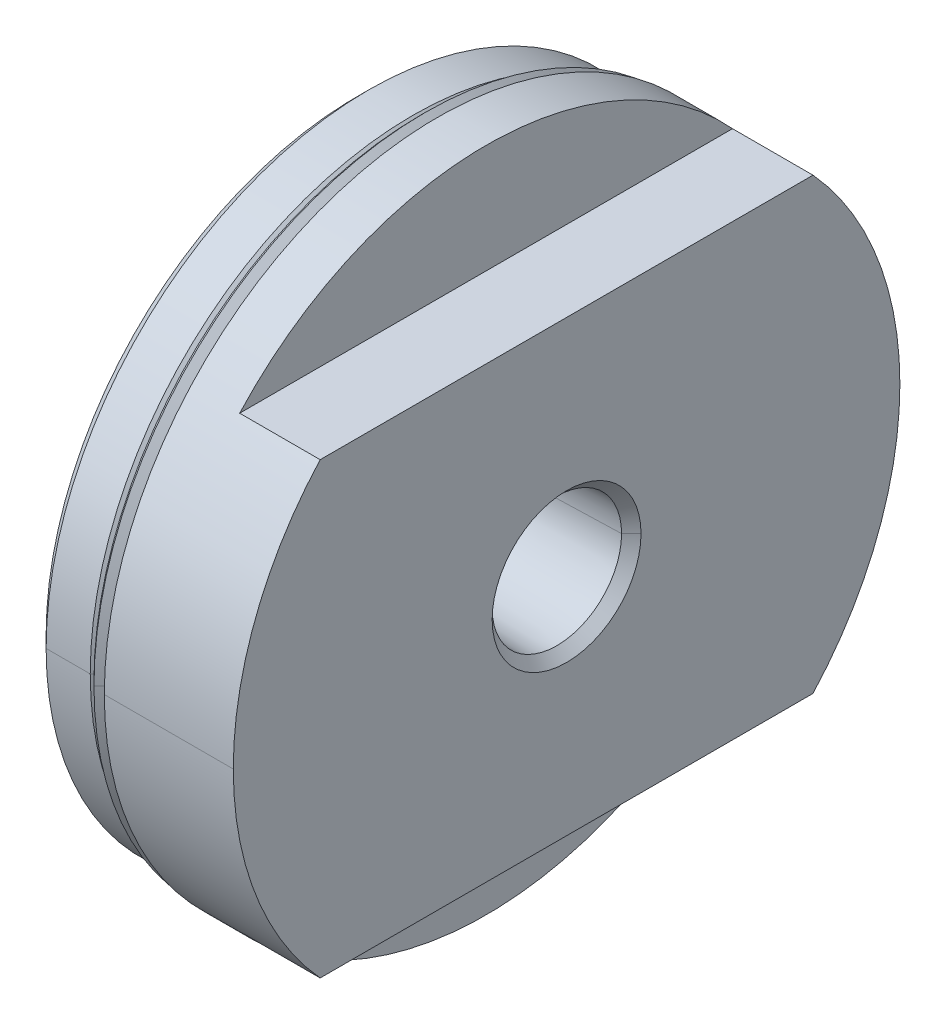
ISO-10303-21;
HEADER;
FILE_DESCRIPTION(('STEP AP214'),'2;1');
FILE_NAME('part.step','',(''),(''),'','','');
FILE_SCHEMA(('AUTOMOTIVE_DESIGN { 1 0 10303 214 1 1 1 1 }'));
ENDSEC;
DATA;
#1=APPLICATION_CONTEXT('core data for automotive mechanical design processes');
#2=APPLICATION_PROTOCOL_DEFINITION('international standard','automotive_design',2000,#1);
#3=PRODUCT_CONTEXT('',#1,'mechanical');
#4=PRODUCT('Part','Part','',(#3));
#5=PRODUCT_RELATED_PRODUCT_CATEGORY('part','',(#4));
#6=PRODUCT_DEFINITION_FORMATION('','',#4);
#7=PRODUCT_DEFINITION_CONTEXT('part definition',#1,'design');
#8=PRODUCT_DEFINITION('design','',#6,#7);
#9=PRODUCT_DEFINITION_SHAPE('','',#8);
#10=(LENGTH_UNIT() NAMED_UNIT(*) SI_UNIT(.MILLI.,.METRE.));
#11=(NAMED_UNIT(*) PLANE_ANGLE_UNIT() SI_UNIT($,.RADIAN.));
#12=(NAMED_UNIT(*) SI_UNIT($,.STERADIAN.) SOLID_ANGLE_UNIT());
#13=UNCERTAINTY_MEASURE_WITH_UNIT(LENGTH_MEASURE(1.E-05),#10,'distance_accuracy_value','');
#14=(GEOMETRIC_REPRESENTATION_CONTEXT(3) GLOBAL_UNCERTAINTY_ASSIGNED_CONTEXT((#13)) GLOBAL_UNIT_ASSIGNED_CONTEXT((#10,
#11,#12)) REPRESENTATION_CONTEXT('',''));
#15=CARTESIAN_POINT('',(0.,0.,0.));
#16=DIRECTION('',(0.,0.,1.));
#17=DIRECTION('',(1.,0.,0.));
#18=AXIS2_PLACEMENT_3D('',#15,#16,#17);
#19=CARTESIAN_POINT('',(12.7,0.,0.));
#20=DIRECTION('',(1.,0.,0.));
#21=DIRECTION('',(0.,0.,-1.));
#22=AXIS2_PLACEMENT_3D('',#19,#20,#21);
#23=PLANE('',#22);
#24=DIRECTION('',(0.,0.,1.));
#25=VECTOR('',#24,1.);
#26=CARTESIAN_POINT('',(12.7,22.098,-32.8168));
#27=LINE('',#26,#25);
#28=CARTESIAN_POINT('',(12.7,22.098,-24.2615077486953));
#29=VERTEX_POINT('',#28);
#30=CARTESIAN_POINT('',(12.7,22.098,24.2615077486953));
#31=VERTEX_POINT('',#30);
#32=EDGE_CURVE('E10',#29,#31,#27,.T.);
#33=ORIENTED_EDGE('',*,*,#32,.F.);
#34=CARTESIAN_POINT('',(12.7,0.,0.));
#35=DIRECTION('',(1.,0.,0.));
#36=DIRECTION('',(0.,0.,-1.));
#37=AXIS2_PLACEMENT_3D('',#34,#35,#36);
#38=CIRCLE('',#37,32.8168);
#39=EDGE_CURVE('E24',#29,#31,#38,.T.);
#40=ORIENTED_EDGE('',*,*,#39,.T.);
#41=EDGE_LOOP('',(#33,#40));
#42=FACE_BOUND('',#41,.T.);
#43=ADVANCED_FACE('F16',(#42),#23,.T.);
#44=CARTESIAN_POINT('',(20.6248,0.,0.));
#45=DIRECTION('',(-1.,0.,0.));
#46=DIRECTION('',(0.,-1.,0.));
#47=AXIS2_PLACEMENT_3D('',#44,#45,#46);
#48=CYLINDRICAL_SURFACE('',#47,32.8168);
#49=CARTESIAN_POINT('',(20.6248,0.,0.));
#50=DIRECTION('',(1.,0.,0.));
#51=DIRECTION('',(0.,0.,-1.));
#52=AXIS2_PLACEMENT_3D('',#49,#50,#51);
#53=CIRCLE('',#52,32.8168);
#54=CARTESIAN_POINT('',(20.6248,22.098,24.2615077486953));
#55=VERTEX_POINT('',#54);
#56=CARTESIAN_POINT('',(20.6248,0.,32.8168));
#57=VERTEX_POINT('',#56);
#58=EDGE_CURVE('E492',#55,#57,#53,.T.);
#59=ORIENTED_EDGE('',*,*,#58,.F.);
#60=DIRECTION('',(1.,0.,0.));
#61=VECTOR('',#60,1.);
#62=CARTESIAN_POINT('',(20.6248,22.098,24.2615077486953));
#63=LINE('',#62,#61);
#64=EDGE_CURVE('E487',#31,#55,#63,.T.);
#65=ORIENTED_EDGE('',*,*,#64,.F.);
#66=ORIENTED_EDGE('',*,*,#39,.F.);
#67=DIRECTION('',(1.,0.,0.));
#68=VECTOR('',#67,1.);
#69=CARTESIAN_POINT('',(20.6248,22.098,-24.2615077486953));
#70=LINE('',#69,#68);
#71=CARTESIAN_POINT('',(20.6248,22.098,-24.2615077486953));
#72=VERTEX_POINT('',#71);
#73=EDGE_CURVE('E483',#29,#72,#70,.T.);
#74=ORIENTED_EDGE('',*,*,#73,.T.);
#75=CARTESIAN_POINT('',(20.6248,0.,0.));
#76=DIRECTION('',(1.,0.,0.));
#77=DIRECTION('',(0.,0.,-1.));
#78=AXIS2_PLACEMENT_3D('',#75,#76,#77);
#79=CIRCLE('',#78,32.8168);
#80=CARTESIAN_POINT('',(20.6248,0.,-32.8168));
#81=VERTEX_POINT('',#80);
#82=EDGE_CURVE('E478',#81,#72,#79,.T.);
#83=ORIENTED_EDGE('',*,*,#82,.F.);
#84=DIRECTION('',(-1.,0.,0.));
#85=VECTOR('',#84,1.);
#86=CARTESIAN_POINT('',(20.6248,0.,-32.8168));
#87=LINE('',#86,#85);
#88=CARTESIAN_POINT('',(7.9248,0.,-32.8168));
#89=VERTEX_POINT('',#88);
#90=EDGE_CURVE('E474',#81,#89,#87,.T.);
#91=ORIENTED_EDGE('',*,*,#90,.T.);
#92=CARTESIAN_POINT('',(7.9248,0.,0.));
#93=DIRECTION('',(1.,0.,0.));
#94=DIRECTION('',(0.,0.,-1.));
#95=AXIS2_PLACEMENT_3D('',#92,#93,#94);
#96=CIRCLE('',#95,32.8168);
#97=CARTESIAN_POINT('',(7.9248,0.,32.8168));
#98=VERTEX_POINT('',#97);
#99=EDGE_CURVE('E470',#89,#98,#96,.T.);
#100=ORIENTED_EDGE('',*,*,#99,.T.);
#101=DIRECTION('',(-1.,0.,0.));
#102=VECTOR('',#101,1.);
#103=CARTESIAN_POINT('',(20.6248,0.,32.8168));
#104=LINE('',#103,#102);
#105=EDGE_CURVE('E465',#57,#98,#104,.T.);
#106=ORIENTED_EDGE('',*,*,#105,.F.);
#107=EDGE_LOOP('',(#59,#65,#66,#74,#83,#91,#100,#106));
#108=FACE_BOUND('',#107,.T.);
#109=ADVANCED_FACE('F507',(#108),#48,.T.);
#110=CARTESIAN_POINT('',(20.6248,0.,0.));
#111=DIRECTION('',(-1.,0.,0.));
#112=DIRECTION('',(0.,1.,0.));
#113=AXIS2_PLACEMENT_3D('',#110,#111,#112);
#114=CYLINDRICAL_SURFACE('',#113,32.8168);
#115=CARTESIAN_POINT('',(7.9248,0.,0.));
#116=DIRECTION('',(1.,0.,0.));
#117=DIRECTION('',(0.,0.,-1.));
#118=AXIS2_PLACEMENT_3D('',#115,#116,#117);
#119=CIRCLE('',#118,32.8168);
#120=EDGE_CURVE('E460',#98,#89,#119,.T.);
#121=ORIENTED_EDGE('',*,*,#120,.T.);
#122=ORIENTED_EDGE('',*,*,#90,.F.);
#123=CARTESIAN_POINT('',(20.6248,0.,0.));
#124=DIRECTION('',(1.,0.,0.));
#125=DIRECTION('',(0.,0.,-1.));
#126=AXIS2_PLACEMENT_3D('',#123,#124,#125);
#127=CIRCLE('',#126,32.8168);
#128=CARTESIAN_POINT('',(20.6248,-22.098,-24.2615077486953));
#129=VERTEX_POINT('',#128);
#130=EDGE_CURVE('E455',#129,#81,#127,.T.);
#131=ORIENTED_EDGE('',*,*,#130,.F.);
#132=DIRECTION('',(1.,0.,0.));
#133=VECTOR('',#132,1.);
#134=CARTESIAN_POINT('',(20.6248,-22.098,-24.2615077486953));
#135=LINE('',#134,#133);
#136=CARTESIAN_POINT('',(12.7,-22.098,-24.2615077486953));
#137=VERTEX_POINT('',#136);
#138=EDGE_CURVE('E450',#137,#129,#135,.T.);
#139=ORIENTED_EDGE('',*,*,#138,.F.);
#140=CARTESIAN_POINT('',(12.7,0.,0.));
#141=DIRECTION('',(1.,0.,0.));
#142=DIRECTION('',(0.,0.,-1.));
#143=AXIS2_PLACEMENT_3D('',#140,#141,#142);
#144=CIRCLE('',#143,32.8168);
#145=CARTESIAN_POINT('',(12.7,-22.098,24.2615077486953));
#146=VERTEX_POINT('',#145);
#147=EDGE_CURVE('E445',#146,#137,#144,.T.);
#148=ORIENTED_EDGE('',*,*,#147,.F.);
#149=DIRECTION('',(1.,0.,0.));
#150=VECTOR('',#149,1.);
#151=CARTESIAN_POINT('',(20.6248,-22.098,24.2615077486953));
#152=LINE('',#151,#150);
#153=CARTESIAN_POINT('',(20.6248,-22.098,24.2615077486953));
#154=VERTEX_POINT('',#153);
#155=EDGE_CURVE('E441',#146,#154,#152,.T.);
#156=ORIENTED_EDGE('',*,*,#155,.T.);
#157=CARTESIAN_POINT('',(20.6248,0.,0.));
#158=DIRECTION('',(1.,0.,0.));
#159=DIRECTION('',(0.,0.,-1.));
#160=AXIS2_PLACEMENT_3D('',#157,#158,#159);
#161=CIRCLE('',#160,32.8168);
#162=EDGE_CURVE('E436',#57,#154,#161,.T.);
#163=ORIENTED_EDGE('',*,*,#162,.F.);
#164=ORIENTED_EDGE('',*,*,#105,.T.);
#165=EDGE_LOOP('',(#121,#122,#131,#139,#148,#156,#163,#164));
#166=FACE_BOUND('',#165,.T.);
#167=ADVANCED_FACE('F511',(#166),#114,.T.);
#168=CARTESIAN_POINT('',(20.6248,32.8168,0.));
#169=DIRECTION('',(-1.,0.,0.));
#170=DIRECTION('',(0.,0.,1.));
#171=AXIS2_PLACEMENT_3D('',#168,#169,#170);
#172=PLANE('',#171);
#173=CARTESIAN_POINT('',(20.6248,0.,0.));
#174=DIRECTION('',(1.,0.,0.));
#175=DIRECTION('',(0.,0.,-1.));
#176=AXIS2_PLACEMENT_3D('',#173,#174,#175);
#177=CIRCLE('',#176,7.32950374584);
#178=CARTESIAN_POINT('',(20.6248,0.,-7.32950374590799));
#179=VERTEX_POINT('',#178);
#180=CARTESIAN_POINT('',(20.6248000003261,0.,7.32950374551395));
#181=VERTEX_POINT('',#180);
#182=EDGE_CURVE('E431',#179,#181,#177,.T.);
#183=ORIENTED_EDGE('',*,*,#182,.F.);
#184=CARTESIAN_POINT('',(20.6248,0.,0.));
#185=DIRECTION('',(1.,0.,0.));
#186=DIRECTION('',(0.,0.,-1.));
#187=AXIS2_PLACEMENT_3D('',#184,#185,#186);
#188=CIRCLE('',#187,7.32950374584);
#189=EDGE_CURVE('E426',#181,#179,#188,.T.);
#190=ORIENTED_EDGE('',*,*,#189,.F.);
#191=EDGE_LOOP('',(#183,#190));
#192=FACE_BOUND('',#191,.T.);
#193=DIRECTION('',(0.,0.,-1.));
#194=VECTOR('',#193,1.);
#195=CARTESIAN_POINT('',(20.6248,22.098,0.));
#196=LINE('',#195,#194);
#197=EDGE_CURVE('E421',#55,#72,#196,.T.);
#198=ORIENTED_EDGE('',*,*,#197,.F.);
#199=ORIENTED_EDGE('',*,*,#58,.T.);
#200=ORIENTED_EDGE('',*,*,#162,.T.);
#201=DIRECTION('',(0.,0.,1.));
#202=VECTOR('',#201,1.);
#203=CARTESIAN_POINT('',(20.6248,-22.098,0.));
#204=LINE('',#203,#202);
#205=EDGE_CURVE('E416',#129,#154,#204,.T.);
#206=ORIENTED_EDGE('',*,*,#205,.F.);
#207=ORIENTED_EDGE('',*,*,#130,.T.);
#208=ORIENTED_EDGE('',*,*,#82,.T.);
#209=EDGE_LOOP('',(#198,#199,#200,#206,#207,#208));
#210=FACE_BOUND('',#209,.T.);
#211=ADVANCED_FACE('F503',(#192,#210),#172,.F.);
#212=CARTESIAN_POINT('',(12.7,-22.098,32.8168));
#213=DIRECTION('',(0.,-1.,0.));
#214=DIRECTION('',(0.,0.,-1.));
#215=AXIS2_PLACEMENT_3D('',#212,#213,#214);
#216=PLANE('',#215);
#217=ORIENTED_EDGE('',*,*,#138,.T.);
#218=ORIENTED_EDGE('',*,*,#205,.T.);
#219=ORIENTED_EDGE('',*,*,#155,.F.);
#220=DIRECTION('',(0.,0.,-1.));
#221=VECTOR('',#220,1.);
#222=CARTESIAN_POINT('',(12.7,-22.098,32.8168));
#223=LINE('',#222,#221);
#224=EDGE_CURVE('E411',#146,#137,#223,.T.);
#225=ORIENTED_EDGE('',*,*,#224,.T.);
#226=EDGE_LOOP('',(#217,#218,#219,#225));
#227=FACE_BOUND('',#226,.T.);
#228=ADVANCED_FACE('F515',(#227),#216,.T.);
#229=CARTESIAN_POINT('',(12.7,0.,0.));
#230=DIRECTION('',(1.,0.,0.));
#231=DIRECTION('',(0.,0.,-1.));
#232=AXIS2_PLACEMENT_3D('',#229,#230,#231);
#233=PLANE('',#232);
#234=ORIENTED_EDGE('',*,*,#147,.T.);
#235=ORIENTED_EDGE('',*,*,#224,.F.);
#236=EDGE_LOOP('',(#234,#235));
#237=FACE_BOUND('',#236,.T.);
#238=ADVANCED_FACE('F517',(#237),#233,.T.);
#239=CARTESIAN_POINT('',(12.7,22.098,-32.8168));
#240=DIRECTION('',(0.,1.,0.));
#241=DIRECTION('',(0.,0.,1.));
#242=AXIS2_PLACEMENT_3D('',#239,#240,#241);
#243=PLANE('',#242);
#244=ORIENTED_EDGE('',*,*,#64,.T.);
#245=ORIENTED_EDGE('',*,*,#197,.T.);
#246=ORIENTED_EDGE('',*,*,#73,.F.);
#247=ORIENTED_EDGE('',*,*,#32,.T.);
#248=EDGE_LOOP('',(#244,#245,#246,#247));
#249=FACE_BOUND('',#248,.T.);
#250=ADVANCED_FACE('F519',(#249),#243,.T.);
#251=CARTESIAN_POINT('',(19.667430358377,0.,0.));
#252=DIRECTION('',(1.,0.,0.));
#253=DIRECTION('',(0.,1.,0.));
#254=AXIS2_PLACEMENT_3D('',#251,#252,#253);
#255=CONICAL_SURFACE('',#254,6.37213410356,0.7853981634);
#256=CARTESIAN_POINT('',(19.667430358377,0.,0.));
#257=DIRECTION('',(1.,0.,0.));
#258=DIRECTION('',(0.,0.,-1.));
#259=AXIS2_PLACEMENT_3D('',#256,#257,#258);
#260=CIRCLE('',#259,6.37213410356);
#261=CARTESIAN_POINT('',(19.667430358377,0.,6.37213410356));
#262=VERTEX_POINT('',#261);
#263=CARTESIAN_POINT('',(19.667430358377,0.,-6.3721341042854));
#264=VERTEX_POINT('',#263);
#265=EDGE_CURVE('E406',#262,#264,#260,.T.);
#266=ORIENTED_EDGE('',*,*,#265,.F.);
#267=DIRECTION('',(0.707106781184742,0.,0.707106781188353));
#268=VECTOR('',#267,1.);
#269=CARTESIAN_POINT('',(19.667430358377,0.,6.37213410356));
#270=LINE('',#269,#268);
#271=EDGE_CURVE('E401',#262,#181,#270,.T.);
#272=ORIENTED_EDGE('',*,*,#271,.T.);
#273=ORIENTED_EDGE('',*,*,#189,.T.);
#274=DIRECTION('',(0.707106781184742,0.,-0.707106781188353));
#275=VECTOR('',#274,1.);
#276=CARTESIAN_POINT('',(19.667430358377,0.,-6.37213410356));
#277=LINE('',#276,#275);
#278=EDGE_CURVE('E396',#264,#179,#277,.T.);
#279=ORIENTED_EDGE('',*,*,#278,.F.);
#280=EDGE_LOOP('',(#266,#272,#273,#279));
#281=FACE_BOUND('',#280,.T.);
#282=ADVANCED_FACE('F526',(#281),#255,.F.);
#283=CARTESIAN_POINT('',(19.667430358377,0.,0.));
#284=DIRECTION('',(1.,0.,0.));
#285=DIRECTION('',(0.,-1.,0.));
#286=AXIS2_PLACEMENT_3D('',#283,#284,#285);
#287=CONICAL_SURFACE('',#286,6.37213410356,0.7853981634);
#288=ORIENTED_EDGE('',*,*,#182,.T.);
#289=ORIENTED_EDGE('',*,*,#271,.F.);
#290=CARTESIAN_POINT('',(19.667430358377,0.,0.));
#291=DIRECTION('',(1.,0.,0.));
#292=DIRECTION('',(0.,0.,-1.));
#293=AXIS2_PLACEMENT_3D('',#290,#291,#292);
#294=CIRCLE('',#293,6.37213410356);
#295=EDGE_CURVE('E391',#264,#262,#294,.T.);
#296=ORIENTED_EDGE('',*,*,#295,.F.);
#297=ORIENTED_EDGE('',*,*,#278,.T.);
#298=EDGE_LOOP('',(#288,#289,#296,#297));
#299=FACE_BOUND('',#298,.T.);
#300=ADVANCED_FACE('F547',(#299),#287,.F.);
#301=CARTESIAN_POINT('',(10.5918,0.,0.));
#302=DIRECTION('',(1.,0.,0.));
#303=DIRECTION('',(0.,-1.,0.));
#304=AXIS2_PLACEMENT_3D('',#301,#302,#303);
#305=CONICAL_SURFACE('',#304,6.08879708324,0.031209405);
#306=ORIENTED_EDGE('',*,*,#295,.T.);
#307=DIRECTION('',(0.999513026048845,0.,0.0312043387797565));
#308=VECTOR('',#307,1.);
#309=CARTESIAN_POINT('',(10.5918,0.,6.08879708324));
#310=LINE('',#309,#308);
#311=CARTESIAN_POINT('',(10.5918,0.,6.08879708324));
#312=VERTEX_POINT('',#311);
#313=EDGE_CURVE('E386',#312,#262,#310,.T.);
#314=ORIENTED_EDGE('',*,*,#313,.F.);
#315=CARTESIAN_POINT('',(10.5918,0.,0.));
#316=DIRECTION('',(1.,0.,0.));
#317=DIRECTION('',(0.,0.,-1.));
#318=AXIS2_PLACEMENT_3D('',#315,#316,#317);
#319=CIRCLE('',#318,6.08879708324);
#320=CARTESIAN_POINT('',(10.5918,0.,-6.08879708221201));
#321=VERTEX_POINT('',#320);
#322=EDGE_CURVE('E381',#321,#312,#319,.T.);
#323=ORIENTED_EDGE('',*,*,#322,.F.);
#324=DIRECTION('',(0.999513026048845,0.,-0.0312043387797565));
#325=VECTOR('',#324,1.);
#326=CARTESIAN_POINT('',(10.5918,0.,-6.08879708324));
#327=LINE('',#326,#325);
#328=EDGE_CURVE('E376',#321,#264,#327,.T.);
#329=ORIENTED_EDGE('',*,*,#328,.T.);
#330=EDGE_LOOP('',(#306,#314,#323,#329));
#331=FACE_BOUND('',#330,.T.);
#332=ADVANCED_FACE('F550',(#331),#305,.F.);
#333=CARTESIAN_POINT('',(10.5918,0.,0.));
#334=DIRECTION('',(1.,0.,0.));
#335=DIRECTION('',(0.,1.,0.));
#336=AXIS2_PLACEMENT_3D('',#333,#334,#335);
#337=CONICAL_SURFACE('',#336,6.08879708324,0.031209405);
#338=CARTESIAN_POINT('',(10.5918,0.,0.));
#339=DIRECTION('',(1.,0.,0.));
#340=DIRECTION('',(0.,0.,-1.));
#341=AXIS2_PLACEMENT_3D('',#338,#339,#340);
#342=CIRCLE('',#341,6.08879708324);
#343=EDGE_CURVE('E371',#312,#321,#342,.T.);
#344=ORIENTED_EDGE('',*,*,#343,.F.);
#345=ORIENTED_EDGE('',*,*,#313,.T.);
#346=ORIENTED_EDGE('',*,*,#265,.T.);
#347=ORIENTED_EDGE('',*,*,#328,.F.);
#348=EDGE_LOOP('',(#344,#345,#346,#347));
#349=FACE_BOUND('',#348,.T.);
#350=ADVANCED_FACE('F553',(#349),#337,.F.);
#351=CARTESIAN_POINT('',(20.6248,0.,0.));
#352=DIRECTION('',(-1.,0.,0.));
#353=DIRECTION('',(0.,1.,0.));
#354=AXIS2_PLACEMENT_3D('',#351,#352,#353);
#355=CYLINDRICAL_SURFACE('',#354,6.08879708324);
#356=CARTESIAN_POINT('',(4.7752,0.,0.));
#357=DIRECTION('',(-1.,0.,0.));
#358=DIRECTION('',(0.,0.,1.));
#359=AXIS2_PLACEMENT_3D('',#356,#357,#358);
#360=CIRCLE('',#359,6.08879708324);
#361=CARTESIAN_POINT('',(4.7752,0.,-6.08879708324));
#362=VERTEX_POINT('',#361);
#363=CARTESIAN_POINT('',(4.7752,0.,6.08879708221201));
#364=VERTEX_POINT('',#363);
#365=EDGE_CURVE('E367',#362,#364,#360,.T.);
#366=ORIENTED_EDGE('',*,*,#365,.T.);
#367=DIRECTION('',(-1.,0.,0.));
#368=VECTOR('',#367,1.);
#369=CARTESIAN_POINT('',(10.5918,0.,6.08879708324));
#370=LINE('',#369,#368);
#371=EDGE_CURVE('E362',#312,#364,#370,.T.);
#372=ORIENTED_EDGE('',*,*,#371,.F.);
#373=ORIENTED_EDGE('',*,*,#343,.T.);
#374=DIRECTION('',(-1.,0.,0.));
#375=VECTOR('',#374,1.);
#376=CARTESIAN_POINT('',(10.5918,0.,-6.08879708324));
#377=LINE('',#376,#375);
#378=EDGE_CURVE('E358',#321,#362,#377,.T.);
#379=ORIENTED_EDGE('',*,*,#378,.T.);
#380=EDGE_LOOP('',(#366,#372,#373,#379));
#381=FACE_BOUND('',#380,.T.);
#382=ADVANCED_FACE('F557',(#381),#355,.F.);
#383=CARTESIAN_POINT('',(20.6248,0.,0.));
#384=DIRECTION('',(-1.,0.,0.));
#385=DIRECTION('',(0.,-1.,0.));
#386=AXIS2_PLACEMENT_3D('',#383,#384,#385);
#387=CYLINDRICAL_SURFACE('',#386,6.08879708324);
#388=ORIENTED_EDGE('',*,*,#322,.T.);
#389=ORIENTED_EDGE('',*,*,#371,.T.);
#390=CARTESIAN_POINT('',(4.7752,0.,0.));
#391=DIRECTION('',(-1.,0.,0.));
#392=DIRECTION('',(0.,0.,1.));
#393=AXIS2_PLACEMENT_3D('',#390,#391,#392);
#394=CIRCLE('',#393,6.08879708324);
#395=EDGE_CURVE('E353',#364,#362,#394,.T.);
#396=ORIENTED_EDGE('',*,*,#395,.T.);
#397=ORIENTED_EDGE('',*,*,#378,.F.);
#398=EDGE_LOOP('',(#388,#389,#396,#397));
#399=FACE_BOUND('',#398,.T.);
#400=ADVANCED_FACE('F561',(#399),#387,.F.);
#401=CARTESIAN_POINT('',(4.7752,22.2885,0.));
#402=DIRECTION('',(-1.,0.,0.));
#403=DIRECTION('',(0.,0.,1.));
#404=AXIS2_PLACEMENT_3D('',#401,#402,#403);
#405=PLANE('',#404);
#406=ORIENTED_EDGE('',*,*,#395,.F.);
#407=ORIENTED_EDGE('',*,*,#365,.F.);
#408=EDGE_LOOP('',(#406,#407));
#409=FACE_BOUND('',#408,.T.);
#410=CARTESIAN_POINT('',(4.7752,0.,0.));
#411=DIRECTION('',(1.,0.,0.));
#412=DIRECTION('',(0.,0.,-1.));
#413=AXIS2_PLACEMENT_3D('',#410,#411,#412);
#414=CIRCLE('',#413,22.2885);
#415=CARTESIAN_POINT('',(4.7752,0.,-22.2885));
#416=VERTEX_POINT('',#415);
#417=CARTESIAN_POINT('',(4.7752,0.,22.2885));
#418=VERTEX_POINT('',#417);
#419=EDGE_CURVE('E348',#416,#418,#414,.T.);
#420=ORIENTED_EDGE('',*,*,#419,.F.);
#421=CARTESIAN_POINT('',(4.7752,0.,0.));
#422=DIRECTION('',(1.,0.,0.));
#423=DIRECTION('',(0.,0.,-1.));
#424=AXIS2_PLACEMENT_3D('',#421,#422,#423);
#425=CIRCLE('',#424,22.2885);
#426=EDGE_CURVE('E343',#418,#416,#425,.T.);
#427=ORIENTED_EDGE('',*,*,#426,.F.);
#428=EDGE_LOOP('',(#420,#427));
#429=FACE_BOUND('',#428,.T.);
#430=ADVANCED_FACE('F563',(#409,#429),#405,.T.);
#431=CARTESIAN_POINT('',(4.7752,0.,0.));
#432=DIRECTION('',(-1.,0.,0.));
#433=DIRECTION('',(0.,1.,0.));
#434=AXIS2_PLACEMENT_3D('',#431,#432,#433);
#435=CYLINDRICAL_SURFACE('',#434,22.2885);
#436=CARTESIAN_POINT('',(0.508,0.,0.));
#437=DIRECTION('',(1.,0.,0.));
#438=DIRECTION('',(0.,0.,-1.));
#439=AXIS2_PLACEMENT_3D('',#436,#437,#438);
#440=CIRCLE('',#439,22.2885);
#441=CARTESIAN_POINT('',(0.507999999998703,0.,22.2884999999987));
#442=VERTEX_POINT('',#441);
#443=CARTESIAN_POINT('',(0.508,0.,-22.2885));
#444=VERTEX_POINT('',#443);
#445=EDGE_CURVE('E338',#442,#444,#440,.T.);
#446=ORIENTED_EDGE('',*,*,#445,.F.);
#447=DIRECTION('',(-1.,0.,0.));
#448=VECTOR('',#447,1.);
#449=CARTESIAN_POINT('',(4.7752,0.,22.2885));
#450=LINE('',#449,#448);
#451=EDGE_CURVE('E333',#418,#442,#450,.T.);
#452=ORIENTED_EDGE('',*,*,#451,.F.);
#453=ORIENTED_EDGE('',*,*,#426,.T.);
#454=DIRECTION('',(-1.,0.,0.));
#455=VECTOR('',#454,1.);
#456=CARTESIAN_POINT('',(4.7752,0.,-22.2885));
#457=LINE('',#456,#455);
#458=EDGE_CURVE('E329',#416,#444,#457,.T.);
#459=ORIENTED_EDGE('',*,*,#458,.T.);
#460=EDGE_LOOP('',(#446,#452,#453,#459));
#461=FACE_BOUND('',#460,.T.);
#462=ADVANCED_FACE('F566',(#461),#435,.F.);
#463=CARTESIAN_POINT('',(4.7752,0.,0.));
#464=DIRECTION('',(-1.,0.,0.));
#465=DIRECTION('',(0.,-1.,0.));
#466=AXIS2_PLACEMENT_3D('',#463,#464,#465);
#467=CYLINDRICAL_SURFACE('',#466,22.2885);
#468=ORIENTED_EDGE('',*,*,#419,.T.);
#469=ORIENTED_EDGE('',*,*,#451,.T.);
#470=CARTESIAN_POINT('',(0.508,0.,0.));
#471=DIRECTION('',(1.,0.,0.));
#472=DIRECTION('',(0.,0.,-1.));
#473=AXIS2_PLACEMENT_3D('',#470,#471,#472);
#474=CIRCLE('',#473,22.2885);
#475=EDGE_CURVE('E324',#444,#442,#474,.T.);
#476=ORIENTED_EDGE('',*,*,#475,.F.);
#477=ORIENTED_EDGE('',*,*,#458,.F.);
#478=EDGE_LOOP('',(#468,#469,#476,#477));
#479=FACE_BOUND('',#478,.T.);
#480=ADVANCED_FACE('F573',(#479),#467,.F.);
#481=CARTESIAN_POINT('',(0.,0.,0.));
#482=DIRECTION('',(-1.,0.,0.));
#483=DIRECTION('',(0.,-1.,0.));
#484=AXIS2_PLACEMENT_3D('',#481,#482,#483);
#485=CONICAL_SURFACE('',#484,22.7965,0.7853981634);
#486=ORIENTED_EDGE('',*,*,#475,.T.);
#487=DIRECTION('',(-0.707106781184743,0.,0.707106781188352));
#488=VECTOR('',#487,1.);
#489=CARTESIAN_POINT('',(0.507999999998703,0.,22.2884999999987));
#490=LINE('',#489,#488);
#491=CARTESIAN_POINT('',(0.,0.,22.7965));
#492=VERTEX_POINT('',#491);
#493=EDGE_CURVE('E320',#442,#492,#490,.T.);
#494=ORIENTED_EDGE('',*,*,#493,.T.);
#495=CARTESIAN_POINT('',(0.,0.,0.));
#496=DIRECTION('',(1.,0.,0.));
#497=DIRECTION('',(0.,0.,-1.));
#498=AXIS2_PLACEMENT_3D('',#495,#496,#497);
#499=CIRCLE('',#498,22.7965);
#500=CARTESIAN_POINT('',(0.,0.,-22.7965));
#501=VERTEX_POINT('',#500);
#502=EDGE_CURVE('E315',#501,#492,#499,.T.);
#503=ORIENTED_EDGE('',*,*,#502,.F.);
#504=DIRECTION('',(-0.707106781184743,0.,-0.707106781188352));
#505=VECTOR('',#504,1.);
#506=CARTESIAN_POINT('',(0.507999999998703,0.,-22.2884999999987));
#507=LINE('',#506,#505);
#508=EDGE_CURVE('E310',#444,#501,#507,.T.);
#509=ORIENTED_EDGE('',*,*,#508,.F.);
#510=EDGE_LOOP('',(#486,#494,#503,#509));
#511=FACE_BOUND('',#510,.T.);
#512=ADVANCED_FACE('F577',(#511),#485,.F.);
#513=CARTESIAN_POINT('',(0.,0.,0.));
#514=DIRECTION('',(-1.,0.,0.));
#515=DIRECTION('',(0.,1.,0.));
#516=AXIS2_PLACEMENT_3D('',#513,#514,#515);
#517=CONICAL_SURFACE('',#516,22.7965,0.7853981634);
#518=CARTESIAN_POINT('',(0.,0.,0.));
#519=DIRECTION('',(1.,0.,0.));
#520=DIRECTION('',(0.,0.,-1.));
#521=AXIS2_PLACEMENT_3D('',#518,#519,#520);
#522=CIRCLE('',#521,22.7965);
#523=EDGE_CURVE('E305',#492,#501,#522,.T.);
#524=ORIENTED_EDGE('',*,*,#523,.F.);
#525=ORIENTED_EDGE('',*,*,#493,.F.);
#526=ORIENTED_EDGE('',*,*,#445,.T.);
#527=ORIENTED_EDGE('',*,*,#508,.T.);
#528=EDGE_LOOP('',(#524,#525,#526,#527));
#529=FACE_BOUND('',#528,.T.);
#530=ADVANCED_FACE('F580',(#529),#517,.F.);
#531=CARTESIAN_POINT('',(0.,0.,0.));
#532=DIRECTION('',(1.,0.,0.));
#533=DIRECTION('',(0.,0.,-1.));
#534=AXIS2_PLACEMENT_3D('',#531,#532,#533);
#535=PLANE('',#534);
#536=CARTESIAN_POINT('',(0.,0.,0.));
#537=DIRECTION('',(1.,0.,0.));
#538=DIRECTION('',(0.,0.,-1.));
#539=AXIS2_PLACEMENT_3D('',#536,#537,#538);
#540=CIRCLE('',#539,30.6197);
#541=CARTESIAN_POINT('',(0.,0.,-30.6197));
#542=VERTEX_POINT('',#541);
#543=CARTESIAN_POINT('',(0.,0.,30.6197));
#544=VERTEX_POINT('',#543);
#545=EDGE_CURVE('E300',#542,#544,#540,.T.);
#546=ORIENTED_EDGE('',*,*,#545,.F.);
#547=CARTESIAN_POINT('',(0.,0.,0.));
#548=DIRECTION('',(1.,0.,0.));
#549=DIRECTION('',(0.,0.,-1.));
#550=AXIS2_PLACEMENT_3D('',#547,#548,#549);
#551=CIRCLE('',#550,30.6197);
#552=EDGE_CURVE('E295',#544,#542,#551,.T.);
#553=ORIENTED_EDGE('',*,*,#552,.F.);
#554=EDGE_LOOP('',(#546,#553));
#555=FACE_BOUND('',#554,.T.);
#556=ORIENTED_EDGE('',*,*,#502,.T.);
#557=ORIENTED_EDGE('',*,*,#523,.T.);
#558=EDGE_LOOP('',(#556,#557));
#559=FACE_BOUND('',#558,.T.);
#560=ADVANCED_FACE('F582',(#555,#559),#535,.F.);
#561=CARTESIAN_POINT('',(0.,0.,0.));
#562=DIRECTION('',(1.,0.,0.));
#563=DIRECTION('',(0.,1.,0.));
#564=AXIS2_PLACEMENT_3D('',#561,#562,#563);
#565=CONICAL_SURFACE('',#564,30.6197,0.7853981634);
#566=ORIENTED_EDGE('',*,*,#552,.T.);
#567=DIRECTION('',(0.707106781184742,0.,-0.707106781188353));
#568=VECTOR('',#567,1.);
#569=CARTESIAN_POINT('',(0.,0.,-30.6197));
#570=LINE('',#569,#568);
#571=CARTESIAN_POINT('',(1.1303,0.,-31.75));
#572=VERTEX_POINT('',#571);
#573=EDGE_CURVE('E291',#542,#572,#570,.T.);
#574=ORIENTED_EDGE('',*,*,#573,.T.);
#575=CARTESIAN_POINT('',(1.1303,0.,0.));
#576=DIRECTION('',(1.,0.,0.));
#577=DIRECTION('',(0.,0.,-1.));
#578=AXIS2_PLACEMENT_3D('',#575,#576,#577);
#579=CIRCLE('',#578,31.75);
#580=CARTESIAN_POINT('',(1.1303,0.,31.75));
#581=VERTEX_POINT('',#580);
#582=EDGE_CURVE('E286',#581,#572,#579,.T.);
#583=ORIENTED_EDGE('',*,*,#582,.F.);
#584=DIRECTION('',(0.707106781184742,0.,0.707106781188353));
#585=VECTOR('',#584,1.);
#586=CARTESIAN_POINT('',(0.,0.,30.6197));
#587=LINE('',#586,#585);
#588=EDGE_CURVE('E281',#544,#581,#587,.T.);
#589=ORIENTED_EDGE('',*,*,#588,.F.);
#590=EDGE_LOOP('',(#566,#574,#583,#589));
#591=FACE_BOUND('',#590,.T.);
#592=ADVANCED_FACE('F584',(#591),#565,.T.);
#593=CARTESIAN_POINT('',(0.,0.,0.));
#594=DIRECTION('',(1.,0.,0.));
#595=DIRECTION('',(0.,-1.,0.));
#596=AXIS2_PLACEMENT_3D('',#593,#594,#595);
#597=CONICAL_SURFACE('',#596,30.6197,0.7853981634);
#598=CARTESIAN_POINT('',(1.1303,0.,0.));
#599=DIRECTION('',(1.,0.,0.));
#600=DIRECTION('',(0.,0.,-1.));
#601=AXIS2_PLACEMENT_3D('',#598,#599,#600);
#602=CIRCLE('',#601,31.75);
#603=EDGE_CURVE('E276',#572,#581,#602,.T.);
#604=ORIENTED_EDGE('',*,*,#603,.F.);
#605=ORIENTED_EDGE('',*,*,#573,.F.);
#606=ORIENTED_EDGE('',*,*,#545,.T.);
#607=ORIENTED_EDGE('',*,*,#588,.T.);
#608=EDGE_LOOP('',(#604,#605,#606,#607));
#609=FACE_BOUND('',#608,.T.);
#610=ADVANCED_FACE('F591',(#609),#597,.T.);
#611=CARTESIAN_POINT('',(20.6248,0.,0.));
#612=DIRECTION('',(-1.,0.,0.));
#613=DIRECTION('',(0.,-1.,0.));
#614=AXIS2_PLACEMENT_3D('',#611,#612,#613);
#615=CYLINDRICAL_SURFACE('',#614,31.75);
#616=CARTESIAN_POINT('',(5.4737,0.,0.));
#617=DIRECTION('',(1.,0.,0.));
#618=DIRECTION('',(0.,0.,-1.));
#619=AXIS2_PLACEMENT_3D('',#616,#617,#618);
#620=CIRCLE('',#619,31.75);
#621=CARTESIAN_POINT('',(5.4737,0.,-31.75));
#622=VERTEX_POINT('',#621);
#623=CARTESIAN_POINT('',(5.4737,0.,31.75));
#624=VERTEX_POINT('',#623);
#625=EDGE_CURVE('E271',#622,#624,#620,.T.);
#626=ORIENTED_EDGE('',*,*,#625,.F.);
#627=DIRECTION('',(-1.,0.,0.));
#628=VECTOR('',#627,1.);
#629=CARTESIAN_POINT('',(5.4737,0.,-31.75));
#630=LINE('',#629,#628);
#631=EDGE_CURVE('E266',#622,#572,#630,.T.);
#632=ORIENTED_EDGE('',*,*,#631,.T.);
#633=ORIENTED_EDGE('',*,*,#603,.T.);
#634=DIRECTION('',(-1.,0.,0.));
#635=VECTOR('',#634,1.);
#636=CARTESIAN_POINT('',(5.4737,0.,31.75));
#637=LINE('',#636,#635);
#638=EDGE_CURVE('E261',#624,#581,#637,.T.);
#639=ORIENTED_EDGE('',*,*,#638,.F.);
#640=EDGE_LOOP('',(#626,#632,#633,#639));
#641=FACE_BOUND('',#640,.T.);
#642=ADVANCED_FACE('F681',(#641),#615,.T.);
#643=CARTESIAN_POINT('',(20.6248,0.,0.));
#644=DIRECTION('',(-1.,0.,0.));
#645=DIRECTION('',(0.,1.,0.));
#646=AXIS2_PLACEMENT_3D('',#643,#644,#645);
#647=CYLINDRICAL_SURFACE('',#646,31.75);
#648=ORIENTED_EDGE('',*,*,#582,.T.);
#649=ORIENTED_EDGE('',*,*,#631,.F.);
#650=CARTESIAN_POINT('',(5.4737,0.,0.));
#651=DIRECTION('',(1.,0.,0.));
#652=DIRECTION('',(0.,0.,-1.));
#653=AXIS2_PLACEMENT_3D('',#650,#651,#652);
#654=CIRCLE('',#653,31.75);
#655=EDGE_CURVE('E256',#624,#622,#654,.T.);
#656=ORIENTED_EDGE('',*,*,#655,.F.);
#657=ORIENTED_EDGE('',*,*,#638,.T.);
#658=EDGE_LOOP('',(#648,#649,#656,#657));
#659=FACE_BOUND('',#658,.T.);
#660=ADVANCED_FACE('F690',(#659),#647,.T.);
#661=CARTESIAN_POINT('',(5.4737,0.,0.));
#662=DIRECTION('',(-1.,0.,0.));
#663=DIRECTION('',(0.,1.,0.));
#664=AXIS2_PLACEMENT_3D('',#661,#662,#663);
#665=CONICAL_SURFACE('',#664,31.75,0.7853981634);
#666=ORIENTED_EDGE('',*,*,#655,.T.);
#667=DIRECTION('',(-0.707106781184742,0.,-0.707106781188353));
#668=VECTOR('',#667,1.);
#669=CARTESIAN_POINT('',(6.60399999999712,0.,-30.6196999999971));
#670=LINE('',#669,#668);
#671=CARTESIAN_POINT('',(6.604,0.,-30.6197));
#672=VERTEX_POINT('',#671);
#673=EDGE_CURVE('E251',#672,#622,#670,.T.);
#674=ORIENTED_EDGE('',*,*,#673,.F.);
#675=CARTESIAN_POINT('',(6.604,0.,0.));
#676=DIRECTION('',(1.,0.,0.));
#677=DIRECTION('',(0.,0.,-1.));
#678=AXIS2_PLACEMENT_3D('',#675,#676,#677);
#679=CIRCLE('',#678,30.6197);
#680=CARTESIAN_POINT('',(6.604,0.,30.6197));
#681=VERTEX_POINT('',#680);
#682=EDGE_CURVE('E246',#681,#672,#679,.T.);
#683=ORIENTED_EDGE('',*,*,#682,.F.);
#684=DIRECTION('',(-0.707106781184742,0.,0.707106781188353));
#685=VECTOR('',#684,1.);
#686=CARTESIAN_POINT('',(6.60399999999712,0.,30.6196999999971));
#687=LINE('',#686,#685);
#688=EDGE_CURVE('E241',#681,#624,#687,.T.);
#689=ORIENTED_EDGE('',*,*,#688,.T.);
#690=EDGE_LOOP('',(#666,#674,#683,#689));
#691=FACE_BOUND('',#690,.T.);
#692=ADVANCED_FACE('F700',(#691),#665,.T.);
#693=CARTESIAN_POINT('',(5.4737,0.,0.));
#694=DIRECTION('',(-1.,0.,0.));
#695=DIRECTION('',(0.,-1.,0.));
#696=AXIS2_PLACEMENT_3D('',#693,#694,#695);
#697=CONICAL_SURFACE('',#696,31.75,0.7853981634);
#698=CARTESIAN_POINT('',(6.604,0.,0.));
#699=DIRECTION('',(1.,0.,0.));
#700=DIRECTION('',(0.,0.,-1.));
#701=AXIS2_PLACEMENT_3D('',#698,#699,#700);
#702=CIRCLE('',#701,30.6197);
#703=EDGE_CURVE('E236',#672,#681,#702,.T.);
#704=ORIENTED_EDGE('',*,*,#703,.F.);
#705=ORIENTED_EDGE('',*,*,#673,.T.);
#706=ORIENTED_EDGE('',*,*,#625,.T.);
#707=ORIENTED_EDGE('',*,*,#688,.F.);
#708=EDGE_LOOP('',(#704,#705,#706,#707));
#709=FACE_BOUND('',#708,.T.);
#710=ADVANCED_FACE('F710',(#709),#697,.T.);
#711=CARTESIAN_POINT('',(20.6248,0.,0.));
#712=DIRECTION('',(-1.,0.,0.));
#713=DIRECTION('',(0.,-1.,0.));
#714=AXIS2_PLACEMENT_3D('',#711,#712,#713);
#715=CYLINDRICAL_SURFACE('',#714,30.6197);
#716=CARTESIAN_POINT('',(7.81685,0.,0.));
#717=DIRECTION('',(1.,0.,0.));
#718=DIRECTION('',(0.,0.,-1.));
#719=AXIS2_PLACEMENT_3D('',#716,#717,#718);
#720=CIRCLE('',#719,30.6197);
#721=CARTESIAN_POINT('',(7.81685,0.,-30.6197));
#722=VERTEX_POINT('',#721);
#723=CARTESIAN_POINT('',(7.81685,0.,30.6197));
#724=VERTEX_POINT('',#723);
#725=EDGE_CURVE('E231',#722,#724,#720,.T.);
#726=ORIENTED_EDGE('',*,*,#725,.F.);
#727=DIRECTION('',(-1.,0.,0.));
#728=VECTOR('',#727,1.);
#729=CARTESIAN_POINT('',(7.81685,0.,-30.6197));
#730=LINE('',#729,#728);
#731=EDGE_CURVE('E226',#722,#672,#730,.T.);
#732=ORIENTED_EDGE('',*,*,#731,.T.);
#733=ORIENTED_EDGE('',*,*,#703,.T.);
#734=DIRECTION('',(-1.,0.,0.));
#735=VECTOR('',#734,1.);
#736=CARTESIAN_POINT('',(7.81685,0.,30.6197));
#737=LINE('',#736,#735);
#738=EDGE_CURVE('E221',#724,#681,#737,.T.);
#739=ORIENTED_EDGE('',*,*,#738,.F.);
#740=EDGE_LOOP('',(#726,#732,#733,#739));
#741=FACE_BOUND('',#740,.T.);
#742=ADVANCED_FACE('F720',(#741),#715,.T.);
#743=CARTESIAN_POINT('',(20.6248,0.,0.));
#744=DIRECTION('',(-1.,0.,0.));
#745=DIRECTION('',(0.,1.,0.));
#746=AXIS2_PLACEMENT_3D('',#743,#744,#745);
#747=CYLINDRICAL_SURFACE('',#746,30.6197);
#748=ORIENTED_EDGE('',*,*,#682,.T.);
#749=ORIENTED_EDGE('',*,*,#731,.F.);
#750=CARTESIAN_POINT('',(7.81685,0.,0.));
#751=DIRECTION('',(1.,0.,0.));
#752=DIRECTION('',(0.,0.,-1.));
#753=AXIS2_PLACEMENT_3D('',#750,#751,#752);
#754=CIRCLE('',#753,30.6197);
#755=EDGE_CURVE('E216',#724,#722,#754,.T.);
#756=ORIENTED_EDGE('',*,*,#755,.F.);
#757=ORIENTED_EDGE('',*,*,#738,.T.);
#758=EDGE_LOOP('',(#748,#749,#756,#757));
#759=FACE_BOUND('',#758,.T.);
#760=ADVANCED_FACE('F730',(#759),#747,.T.);
#761=CARTESIAN_POINT('',(7.81685,0.,0.));
#762=DIRECTION('',(-1.,0.,0.));
#763=DIRECTION('',(0.,1.,0.));
#764=AXIS2_PLACEMENT_3D('',#761,#762,#763);
#765=CONICAL_SURFACE('',#764,30.6197,0.7853981634);
#766=CARTESIAN_POINT('',(6.26326569105499,0.,0.));
#767=DIRECTION('',(1.,0.,0.));
#768=DIRECTION('',(0.,0.,-1.));
#769=AXIS2_PLACEMENT_3D('',#766,#767,#768);
#770=CIRCLE('',#769,32.17328430964);
#771=CARTESIAN_POINT('',(6.26326569105499,0.,32.17328430964));
#772=VERTEX_POINT('',#771);
#773=CARTESIAN_POINT('',(6.26326569105499,0.,-32.1732843089451));
#774=VERTEX_POINT('',#773);
#775=EDGE_CURVE('E211',#772,#774,#770,.T.);
#776=ORIENTED_EDGE('',*,*,#775,.F.);
#777=DIRECTION('',(-0.707106781184745,0.,0.70710678118835));
#778=VECTOR('',#777,1.);
#779=CARTESIAN_POINT('',(7.81685,0.,30.6197));
#780=LINE('',#779,#778);
#781=EDGE_CURVE('E206',#724,#772,#780,.T.);
#782=ORIENTED_EDGE('',*,*,#781,.F.);
#783=ORIENTED_EDGE('',*,*,#755,.T.);
#784=DIRECTION('',(-0.707106781184745,0.,-0.70710678118835));
#785=VECTOR('',#784,1.);
#786=CARTESIAN_POINT('',(7.81685,0.,-30.6197));
#787=LINE('',#786,#785);
#788=EDGE_CURVE('E202',#722,#774,#787,.T.);
#789=ORIENTED_EDGE('',*,*,#788,.T.);
#790=EDGE_LOOP('',(#776,#782,#783,#789));
#791=FACE_BOUND('',#790,.T.);
#792=ADVANCED_FACE('F740',(#791),#765,.F.);
#793=CARTESIAN_POINT('',(7.81685,0.,0.));
#794=DIRECTION('',(-1.,0.,0.));
#795=DIRECTION('',(0.,-1.,0.));
#796=AXIS2_PLACEMENT_3D('',#793,#794,#795);
#797=CONICAL_SURFACE('',#796,30.6197,0.7853981634);
#798=ORIENTED_EDGE('',*,*,#725,.T.);
#799=ORIENTED_EDGE('',*,*,#781,.T.);
#800=CARTESIAN_POINT('',(6.26326569105499,0.,0.));
#801=DIRECTION('',(1.,0.,0.));
#802=DIRECTION('',(0.,0.,-1.));
#803=AXIS2_PLACEMENT_3D('',#800,#801,#802);
#804=CIRCLE('',#803,32.17328430964);
#805=EDGE_CURVE('E197',#774,#772,#804,.T.);
#806=ORIENTED_EDGE('',*,*,#805,.F.);
#807=ORIENTED_EDGE('',*,*,#788,.F.);
#808=EDGE_LOOP('',(#798,#799,#806,#807));
#809=FACE_BOUND('',#808,.T.);
#810=ADVANCED_FACE('F750',(#809),#797,.F.);
#811=CARTESIAN_POINT('',(6.26326569105499,0.,0.));
#812=DIRECTION('',(1.,0.,0.));
#813=DIRECTION('',(0.,-1.,0.));
#814=AXIS2_PLACEMENT_3D('',#811,#812,#813);
#815=CONICAL_SURFACE('',#814,32.17328430964,0.7853981634);
#816=CARTESIAN_POINT('',(6.6920729208361,0.,0.));
#817=DIRECTION('',(1.,0.,0.));
#818=DIRECTION('',(0.,0.,-1.));
#819=AXIS2_PLACEMENT_3D('',#816,#817,#818);
#820=CIRCLE('',#819,32.6020915394);
#821=CARTESIAN_POINT('',(6.6920729208361,0.,-32.6020915387259));
#822=VERTEX_POINT('',#821);
#823=CARTESIAN_POINT('',(6.6920729208361,0.,32.6020915394));
#824=VERTEX_POINT('',#823);
#825=EDGE_CURVE('E169',#822,#824,#820,.T.);
#826=ORIENTED_EDGE('',*,*,#825,.F.);
#827=DIRECTION('',(0.707106781184743,0.,-0.707106781188352));
#828=VECTOR('',#827,1.);
#829=CARTESIAN_POINT('',(6.26326569105499,0.,-32.17328430964));
#830=LINE('',#829,#828);
#831=EDGE_CURVE('E189',#774,#822,#830,.T.);
#832=ORIENTED_EDGE('',*,*,#831,.F.);
#833=ORIENTED_EDGE('',*,*,#805,.T.);
#834=DIRECTION('',(0.707106781184743,0.,0.707106781188352));
#835=VECTOR('',#834,1.);
#836=CARTESIAN_POINT('',(6.26326569105499,0.,32.17328430964));
#837=LINE('',#836,#835);
#838=EDGE_CURVE('E185',#772,#824,#837,.T.);
#839=ORIENTED_EDGE('',*,*,#838,.T.);
#840=EDGE_LOOP('',(#826,#832,#833,#839));
#841=FACE_BOUND('',#840,.T.);
#842=ADVANCED_FACE('F760',(#841),#815,.T.);
#843=CARTESIAN_POINT('',(6.26326569105499,0.,0.));
#844=DIRECTION('',(1.,0.,0.));
#845=DIRECTION('',(0.,1.,0.));
#846=AXIS2_PLACEMENT_3D('',#843,#844,#845);
#847=CONICAL_SURFACE('',#846,32.17328430964,0.7853981634);
#848=ORIENTED_EDGE('',*,*,#775,.T.);
#849=ORIENTED_EDGE('',*,*,#831,.T.);
#850=CARTESIAN_POINT('',(6.6920729208361,0.,0.));
#851=DIRECTION('',(1.,0.,0.));
#852=DIRECTION('',(0.,0.,-1.));
#853=AXIS2_PLACEMENT_3D('',#850,#851,#852);
#854=CIRCLE('',#853,32.6020915394);
#855=EDGE_CURVE('E181',#824,#822,#854,.T.);
#856=ORIENTED_EDGE('',*,*,#855,.F.);
#857=ORIENTED_EDGE('',*,*,#838,.F.);
#858=EDGE_LOOP('',(#848,#849,#856,#857));
#859=FACE_BOUND('',#858,.T.);
#860=ADVANCED_FACE('F770',(#859),#847,.T.);
#861=CARTESIAN_POINT('',(6.6920729208361,0.,0.));
#862=DIRECTION('',(-1.,0.,0.));
#863=DIRECTION('',(0.,1.,0.));
#864=AXIS2_PLACEMENT_3D('',#861,#862,#863);
#865=CONICAL_SURFACE('',#864,32.6020915394,0.7853981634);
#866=ORIENTED_EDGE('',*,*,#855,.T.);
#867=DIRECTION('',(-0.707106781184744,0.,-0.707106781188351));
#868=VECTOR('',#867,1.);
#869=CARTESIAN_POINT('',(7.9248000003549,0.,-31.3693644598749));
#870=LINE('',#869,#868);
#871=CARTESIAN_POINT('',(7.9248,0.,-31.3693644595619));
#872=VERTEX_POINT('',#871);
#873=EDGE_CURVE('E161',#872,#822,#870,.T.);
#874=ORIENTED_EDGE('',*,*,#873,.F.);
#875=CARTESIAN_POINT('',(7.9248,0.,0.));
#876=DIRECTION('',(1.,0.,0.));
#877=DIRECTION('',(0.,0.,-1.));
#878=AXIS2_PLACEMENT_3D('',#875,#876,#877);
#879=CIRCLE('',#878,31.36936445952);
#880=CARTESIAN_POINT('',(7.9248000003549,0.,31.3693644598749));
#881=VERTEX_POINT('',#880);
#882=EDGE_CURVE('E154',#881,#872,#879,.T.);
#883=ORIENTED_EDGE('',*,*,#882,.F.);
#884=DIRECTION('',(-0.707106781184744,0.,0.707106781188351));
#885=VECTOR('',#884,1.);
#886=CARTESIAN_POINT('',(7.9248000003549,0.,31.3693644598749));
#887=LINE('',#886,#885);
#888=EDGE_CURVE('E158',#881,#824,#887,.T.);
#889=ORIENTED_EDGE('',*,*,#888,.T.);
#890=EDGE_LOOP('',(#866,#874,#883,#889));
#891=FACE_BOUND('',#890,.T.);
#892=ADVANCED_FACE('F157',(#891),#865,.T.);
#893=CARTESIAN_POINT('',(6.6920729208361,0.,0.));
#894=DIRECTION('',(-1.,0.,0.));
#895=DIRECTION('',(0.,-1.,0.));
#896=AXIS2_PLACEMENT_3D('',#893,#894,#895);
#897=CONICAL_SURFACE('',#896,32.6020915394,0.7853981634);
#898=CARTESIAN_POINT('',(7.9248,0.,0.));
#899=DIRECTION('',(1.,0.,0.));
#900=DIRECTION('',(0.,0.,-1.));
#901=AXIS2_PLACEMENT_3D('',#898,#899,#900);
#902=CIRCLE('',#901,31.36936445952);
#903=EDGE_CURVE('E168',#872,#881,#902,.T.);
#904=ORIENTED_EDGE('',*,*,#903,.F.);
#905=ORIENTED_EDGE('',*,*,#873,.T.);
#906=ORIENTED_EDGE('',*,*,#825,.T.);
#907=ORIENTED_EDGE('',*,*,#888,.F.);
#908=EDGE_LOOP('',(#904,#905,#906,#907));
#909=FACE_BOUND('',#908,.T.);
#910=ADVANCED_FACE('F167',(#909),#897,.T.);
#911=CARTESIAN_POINT('',(7.9248,31.3693644595619,0.));
#912=DIRECTION('',(1.,0.,0.));
#913=DIRECTION('',(0.,0.,-1.));
#914=AXIS2_PLACEMENT_3D('',#911,#912,#913);
#915=PLANE('',#914);
#916=ORIENTED_EDGE('',*,*,#99,.F.);
#917=ORIENTED_EDGE('',*,*,#120,.F.);
#918=EDGE_LOOP('',(#916,#917));
#919=FACE_BOUND('',#918,.T.);
#920=ORIENTED_EDGE('',*,*,#903,.T.);
#921=ORIENTED_EDGE('',*,*,#882,.T.);
#922=EDGE_LOOP('',(#920,#921));
#923=FACE_BOUND('',#922,.T.);
#924=ADVANCED_FACE('F171',(#919,#923),#915,.F.);
#925=CLOSED_SHELL('',(#43,#109,#167,#211,#228,#238,#250,#282,#300,#332,#350,#382,#400,#430,#462,
#480,#512,#530,#560,#592,#610,#642,#660,#692,#710,#742,#760,#792,#810,#842,#860,#892,#910,#924));
#926=MANIFOLD_SOLID_BREP('B1',#925);
#927=ADVANCED_BREP_SHAPE_REPRESENTATION('',(#18,#926),#14);
#928=SHAPE_DEFINITION_REPRESENTATION(#9,#927);
ENDSEC;
END-ISO-10303-21;
